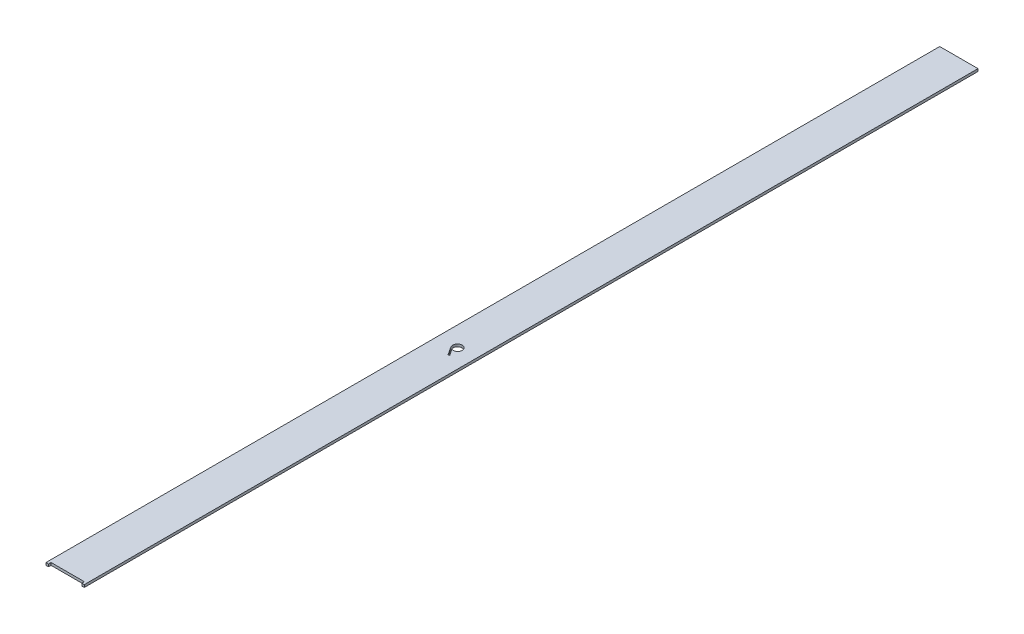
ISO-10303-21;
HEADER;
FILE_DESCRIPTION(('STEP AP214'),'2;1');
FILE_NAME('part.step','',(''),(''),'','','');
FILE_SCHEMA(('AUTOMOTIVE_DESIGN { 1 0 10303 214 1 1 1 1 }'));
ENDSEC;
DATA;
#1=APPLICATION_CONTEXT('core data for automotive mechanical design processes');
#2=APPLICATION_PROTOCOL_DEFINITION('international standard','automotive_design',2000,#1);
#3=PRODUCT_CONTEXT('',#1,'mechanical');
#4=PRODUCT('Part','Part','',(#3));
#5=PRODUCT_RELATED_PRODUCT_CATEGORY('part','',(#4));
#6=PRODUCT_DEFINITION_FORMATION('','',#4);
#7=PRODUCT_DEFINITION_CONTEXT('part definition',#1,'design');
#8=PRODUCT_DEFINITION('design','',#6,#7);
#9=PRODUCT_DEFINITION_SHAPE('','',#8);
#10=(LENGTH_UNIT() NAMED_UNIT(*) SI_UNIT(.MILLI.,.METRE.));
#11=(NAMED_UNIT(*) PLANE_ANGLE_UNIT() SI_UNIT($,.RADIAN.));
#12=(NAMED_UNIT(*) SI_UNIT($,.STERADIAN.) SOLID_ANGLE_UNIT());
#13=UNCERTAINTY_MEASURE_WITH_UNIT(LENGTH_MEASURE(1.E-05),#10,'distance_accuracy_value','');
#14=(GEOMETRIC_REPRESENTATION_CONTEXT(3) GLOBAL_UNCERTAINTY_ASSIGNED_CONTEXT((#13)) GLOBAL_UNIT_ASSIGNED_CONTEXT((#10,
#11,#12)) REPRESENTATION_CONTEXT('',''));
#15=CARTESIAN_POINT('',(0.,0.,0.));
#16=DIRECTION('',(0.,0.,1.));
#17=DIRECTION('',(1.,0.,0.));
#18=AXIS2_PLACEMENT_3D('',#15,#16,#17);
#19=CARTESIAN_POINT('',(28.333397421911,-200.,-54.7794623895226));
#20=DIRECTION('',(0.836933063027773,0.,-0.547305260353809));
#21=DIRECTION('',(-0.547305260353809,0.,-0.836933063027773));
#22=AXIS2_PLACEMENT_3D('',#19,#20,#21);
#23=PLANE('',#22);
#24=DIRECTION('',(0.,-1.,0.));
#25=VECTOR('',#24,1.);
#26=CARTESIAN_POINT('',(28.333397421911,-200.,-54.7794623895226));
#27=LINE('',#26,#25);
#28=CARTESIAN_POINT('',(28.333397421911,-196.825,-54.7794623895226));
#29=VERTEX_POINT('',#28);
#30=CARTESIAN_POINT('',(28.333397421911,-200.,-54.7794623895226));
#31=VERTEX_POINT('',#30);
#32=EDGE_CURVE('E11',#29,#31,#27,.T.);
#33=ORIENTED_EDGE('',*,*,#32,.F.);
#34=DIRECTION('',(-0.547305260353809,0.,-0.836933063027773));
#35=VECTOR('',#34,1.);
#36=CARTESIAN_POINT('',(28.333397421911,-196.825,-54.7794623895226));
#37=LINE('',#36,#35);
#38=CARTESIAN_POINT('',(23.2999539122956,-196.825,-62.476547726061));
#39=VERTEX_POINT('',#38);
#40=EDGE_CURVE('E145',#29,#39,#37,.T.);
#41=ORIENTED_EDGE('',*,*,#40,.T.);
#42=DIRECTION('',(0.,-1.,0.));
#43=VECTOR('',#42,1.);
#44=CARTESIAN_POINT('',(23.2999539122956,-200.,-62.4765477260611));
#45=LINE('',#44,#43);
#46=CARTESIAN_POINT('',(23.2999539122956,-200.,-62.4765477260611));
#47=VERTEX_POINT('',#46);
#48=EDGE_CURVE('E62',#39,#47,#45,.T.);
#49=ORIENTED_EDGE('',*,*,#48,.T.);
#50=DIRECTION('',(-0.547305260353809,0.,-0.836933063027773));
#51=VECTOR('',#50,1.);
#52=CARTESIAN_POINT('',(28.333397421911,-200.,-54.7794623895226));
#53=LINE('',#52,#51);
#54=EDGE_CURVE('E261',#31,#47,#53,.T.);
#55=ORIENTED_EDGE('',*,*,#54,.F.);
#56=EDGE_LOOP('',(#33,#41,#49,#55));
#57=FACE_BOUND('',#56,.T.);
#58=ADVANCED_FACE('F51',(#57),#23,.F.);
#59=CARTESIAN_POINT('',(23.2999539122956,-200.,-62.4765477260611));
#60=CARTESIAN_POINT('',(23.635072134162,-200.,-62.4231322845037));
#61=CARTESIAN_POINT('',(24.2887581164709,-200.,-62.3189394262626));
#62=CARTESIAN_POINT('',(24.9504239355822,-200.,-62.3017511803219));
#63=CARTESIAN_POINT('',(25.2728805949879,-200.,-62.293374649138));
#64=B_SPLINE_CURVE_WITH_KNOTS('',3,(#59,#60,#61,#62,#63),.UNSPECIFIED.,.F.,.F.,(4,1,4),(0.,
0.512659336341781,1.),.UNSPECIFIED.);
#65=DIRECTION('',(0.,1.,0.));
#66=VECTOR('',#65,1.);
#67=SURFACE_OF_LINEAR_EXTRUSION('',#64,#66);
#68=ORIENTED_EDGE('',*,*,#48,.F.);
#69=CARTESIAN_POINT('',(23.2999539122956,-196.825,-62.4765477260611));
#70=CARTESIAN_POINT('',(23.635072134162,-196.825,-62.4231322845037));
#71=CARTESIAN_POINT('',(24.2887581164709,-196.825,-62.3189394262626));
#72=CARTESIAN_POINT('',(24.9504239355822,-196.825,-62.3017511803219));
#73=CARTESIAN_POINT('',(25.2728805949879,-196.825,-62.293374649138));
#74=B_SPLINE_CURVE_WITH_KNOTS('',3,(#69,#70,#71,#72,#73),.UNSPECIFIED.,.F.,.F.,(4,1,4),(0.,
0.512659336341781,1.),.UNSPECIFIED.);
#75=CARTESIAN_POINT('',(25.2728805949879,-196.825,-62.293374649138));
#76=VERTEX_POINT('',#75);
#77=EDGE_CURVE('E193',#39,#76,#74,.T.);
#78=ORIENTED_EDGE('',*,*,#77,.T.);
#79=DIRECTION('',(0.,-1.,0.));
#80=VECTOR('',#79,1.);
#81=CARTESIAN_POINT('',(25.2728805949879,-200.,-62.293374649138));
#82=LINE('',#81,#80);
#83=CARTESIAN_POINT('',(25.2728805949879,-200.,-62.293374649138));
#84=VERTEX_POINT('',#83);
#85=EDGE_CURVE('E252',#76,#84,#82,.T.);
#86=ORIENTED_EDGE('',*,*,#85,.T.);
#87=EDGE_CURVE('E270',#47,#84,#64,.T.);
#88=ORIENTED_EDGE('',*,*,#87,.F.);
#89=EDGE_LOOP('',(#68,#78,#86,#88));
#90=FACE_BOUND('',#89,.T.);
#91=ADVANCED_FACE('F274',(#90),#67,.F.);
#92=CARTESIAN_POINT('',(25.2728805949879,-200.,-62.293374649138));
#93=CARTESIAN_POINT('',(25.466496610755,-200.,-62.2985786285107));
#94=CARTESIAN_POINT('',(25.8476239760938,-200.,-62.3088225070439));
#95=CARTESIAN_POINT('',(26.4071867136408,-200.,-62.3876560372381));
#96=CARTESIAN_POINT('',(26.9448807794377,-200.,-62.5118898607081));
#97=CARTESIAN_POINT('',(27.4584775547135,-200.,-62.6929859966547));
#98=CARTESIAN_POINT('',(27.9498204988349,-200.,-62.9243202396838));
#99=CARTESIAN_POINT('',(28.4217292547971,-200.,-63.201573233639));
#100=CARTESIAN_POINT('',(28.8653330526609,-200.,-63.5390612938665));
#101=CARTESIAN_POINT('',(29.2863444709428,-200.,-63.9160605532044));
#102=CARTESIAN_POINT('',(29.6685805296102,-200.,-64.3336201402422));
#103=CARTESIAN_POINT('',(30.0069959177161,-200.,-64.7766759871709));
#104=CARTESIAN_POINT('',(30.2912588841547,-200.,-65.2447664966039));
#105=CARTESIAN_POINT('',(30.5218940860855,-200.,-65.7376545811839));
#106=CARTESIAN_POINT('',(30.7009906395968,-200.,-66.2545804653634));
#107=CARTESIAN_POINT('',(30.8315519647627,-200.,-66.794882767436));
#108=CARTESIAN_POINT('',(30.908729462825,-200.,-67.3589340620975));
#109=CARTESIAN_POINT('',(30.9192096337171,-200.,-67.7425367017606));
#110=CARTESIAN_POINT('',(30.9245332392186,-200.,-67.9373950818303));
#111=B_SPLINE_CURVE_WITH_KNOTS('',3,(#92,#93,#94,#95,#96,#97,#98,#99,#100,#101,#102,#103,#104,
#105,#106,#107,#108,#109,#110),.UNSPECIFIED.,.F.,.F.,(4,1,1,1,1,1,1,1,1,1,1,1,1,1,1,1,4),(0.,
0.0652308037420294,0.128404896003223,0.190067071596478,0.25094336576828,0.311545832852143,
0.37286280215683,0.435023673856238,0.499071724707044,0.563091075049662,0.625510106330375,
0.686680035929649,0.747282503013513,0.808563495215959,0.870742103515987,0.934340951505912,1.),.UNSPECIFIED.);
#112=DIRECTION('',(0.,1.,0.));
#113=VECTOR('',#112,1.);
#114=SURFACE_OF_LINEAR_EXTRUSION('',#111,#113);
#115=ORIENTED_EDGE('',*,*,#85,.F.);
#116=CARTESIAN_POINT('',(25.2728805949879,-196.825,-62.293374649138));
#117=CARTESIAN_POINT('',(25.466496610755,-196.825,-62.2985786285107));
#118=CARTESIAN_POINT('',(25.8476239760938,-196.825,-62.3088225070439));
#119=CARTESIAN_POINT('',(26.4071867136408,-196.825,-62.3876560372381));
#120=CARTESIAN_POINT('',(26.9448807794377,-196.825,-62.5118898607081));
#121=CARTESIAN_POINT('',(27.4584775547135,-196.825,-62.6929859966547));
#122=CARTESIAN_POINT('',(27.9498204988349,-196.825,-62.9243202396838));
#123=CARTESIAN_POINT('',(28.4217292547971,-196.825,-63.201573233639));
#124=CARTESIAN_POINT('',(28.8653330526609,-196.825,-63.5390612938665));
#125=CARTESIAN_POINT('',(29.2863444709428,-196.825,-63.9160605532044));
#126=CARTESIAN_POINT('',(29.6685805296102,-196.825,-64.3336201402422));
#127=CARTESIAN_POINT('',(30.0069959177161,-196.825,-64.7766759871709));
#128=CARTESIAN_POINT('',(30.2912588841547,-196.825,-65.2447664966039));
#129=CARTESIAN_POINT('',(30.5218940860855,-196.825,-65.7376545811839));
#130=CARTESIAN_POINT('',(30.7009906395968,-196.825,-66.2545804653634));
#131=CARTESIAN_POINT('',(30.8315519647627,-196.825,-66.794882767436));
#132=CARTESIAN_POINT('',(30.908729462825,-196.825,-67.3589340620975));
#133=CARTESIAN_POINT('',(30.9192096337171,-196.825,-67.7425367017606));
#134=CARTESIAN_POINT('',(30.9245332392186,-196.825,-67.9373950818303));
#135=B_SPLINE_CURVE_WITH_KNOTS('',3,(#116,#117,#118,#119,#120,#121,#122,#123,#124,#125,#126,
#127,#128,#129,#130,#131,#132,#133,#134),.UNSPECIFIED.,.F.,.F.,(4,1,1,1,1,1,1,1,1,1,1,1,1,1,1,1,
4),(0.,0.0652308037420294,0.128404896003223,0.190067071596478,0.25094336576828,
0.311545832852143,0.37286280215683,0.435023673856238,0.499071724707044,0.563091075049662,
0.625510106330375,0.686680035929649,0.747282503013513,0.808563495215959,0.870742103515987,
0.934340951505912,1.),.UNSPECIFIED.);
#136=CARTESIAN_POINT('',(30.9245332392186,-196.825,-67.9373950818303));
#137=VERTEX_POINT('',#136);
#138=EDGE_CURVE('E184',#76,#137,#135,.T.);
#139=ORIENTED_EDGE('',*,*,#138,.T.);
#140=DIRECTION('',(0.,-1.,0.));
#141=VECTOR('',#140,1.);
#142=CARTESIAN_POINT('',(30.9245332392186,-200.,-67.9373950818303));
#143=LINE('',#142,#141);
#144=CARTESIAN_POINT('',(30.9245332392186,-200.,-67.9373950818303));
#145=VERTEX_POINT('',#144);
#146=EDGE_CURVE('E248',#137,#145,#143,.T.);
#147=ORIENTED_EDGE('',*,*,#146,.T.);
#148=EDGE_CURVE('E276',#84,#145,#111,.T.);
#149=ORIENTED_EDGE('',*,*,#148,.F.);
#150=EDGE_LOOP('',(#115,#139,#147,#149));
#151=FACE_BOUND('',#150,.T.);
#152=ADVANCED_FACE('F295',(#151),#114,.F.);
#153=CARTESIAN_POINT('',(30.9245332392186,-200.,-67.9373950818303));
#154=CARTESIAN_POINT('',(30.9167874826346,-200.,-68.2039846133123));
#155=CARTESIAN_POINT('',(30.9015456667687,-200.,-68.7285697208519));
#156=CARTESIAN_POINT('',(30.7496692912848,-200.,-69.4926200799963));
#157=CARTESIAN_POINT('',(30.5136689391165,-200.,-70.2205070573977));
#158=CARTESIAN_POINT('',(30.1763341059508,-200.,-70.9006093187028));
#159=CARTESIAN_POINT('',(29.7573299928536,-200.,-71.5319947331207));
#160=CARTESIAN_POINT('',(29.2463676670475,-200.,-72.0914413377731));
#161=CARTESIAN_POINT('',(28.6615681091149,-200.,-72.5903882551726));
#162=CARTESIAN_POINT('',(28.0003328218781,-200.,-73.0076192825757));
#163=CARTESIAN_POINT('',(27.2887175457591,-200.,-73.3483587459434));
#164=CARTESIAN_POINT('',(26.5411302455468,-200.,-73.5930981349944));
#165=CARTESIAN_POINT('',(25.7648310633292,-200.,-73.7437753041079));
#166=CARTESIAN_POINT('',(25.2379374109179,-200.,-73.7626652986255));
#167=CARTESIAN_POINT('',(24.9714082392186,-200.,-73.7722208029842));
#168=B_SPLINE_CURVE_WITH_KNOTS('',3,(#153,#154,#155,#156,#157,#158,#159,#160,#161,#162,#163,
#164,#165,#166,#167),.UNSPECIFIED.,.F.,.F.,(4,1,1,1,1,1,1,1,1,1,1,1,4),(0.,0.085947943144129,
0.169125211880691,0.250399107186049,0.332289736138836,0.413364287915881,0.494172283371189,
0.576021735386637,0.660756969254007,0.745783125913744,0.830043592975224,0.914027545820683,1.),.UNSPECIFIED.);
#169=DIRECTION('',(0.,1.,0.));
#170=VECTOR('',#169,1.);
#171=SURFACE_OF_LINEAR_EXTRUSION('',#168,#170);
#172=ORIENTED_EDGE('',*,*,#146,.F.);
#173=CARTESIAN_POINT('',(30.9245332392186,-196.825,-67.9373950818303));
#174=CARTESIAN_POINT('',(30.9167874826346,-196.825,-68.2039846133123));
#175=CARTESIAN_POINT('',(30.9015456667687,-196.825,-68.7285697208519));
#176=CARTESIAN_POINT('',(30.7496692912848,-196.825,-69.4926200799963));
#177=CARTESIAN_POINT('',(30.5136689391165,-196.825,-70.2205070573977));
#178=CARTESIAN_POINT('',(30.1763341059508,-196.825,-70.9006093187028));
#179=CARTESIAN_POINT('',(29.7573299928536,-196.825,-71.5319947331207));
#180=CARTESIAN_POINT('',(29.2463676670475,-196.825,-72.0914413377731));
#181=CARTESIAN_POINT('',(28.6615681091149,-196.825,-72.5903882551726));
#182=CARTESIAN_POINT('',(28.0003328218781,-196.825,-73.0076192825757));
#183=CARTESIAN_POINT('',(27.2887175457591,-196.825,-73.3483587459434));
#184=CARTESIAN_POINT('',(26.5411302455468,-196.825,-73.5930981349944));
#185=CARTESIAN_POINT('',(25.7648310633292,-196.825,-73.7437753041079));
#186=CARTESIAN_POINT('',(25.2379374109179,-196.825,-73.7626652986255));
#187=CARTESIAN_POINT('',(24.9714082392186,-196.825,-73.7722208029842));
#188=B_SPLINE_CURVE_WITH_KNOTS('',3,(#173,#174,#175,#176,#177,#178,#179,#180,#181,#182,#183,
#184,#185,#186,#187),.UNSPECIFIED.,.F.,.F.,(4,1,1,1,1,1,1,1,1,1,1,1,4),(0.,0.085947943144129,
0.169125211880691,0.250399107186049,0.332289736138836,0.413364287915881,0.494172283371189,
0.576021735386637,0.660756969254007,0.745783125913744,0.830043592975224,0.914027545820683,1.),.UNSPECIFIED.);
#189=CARTESIAN_POINT('',(24.9714082392186,-196.825,-73.7722208029842));
#190=VERTEX_POINT('',#189);
#191=EDGE_CURVE('E175',#137,#190,#188,.T.);
#192=ORIENTED_EDGE('',*,*,#191,.T.);
#193=DIRECTION('',(0.,-1.,0.));
#194=VECTOR('',#193,1.);
#195=CARTESIAN_POINT('',(24.9714082392186,-200.,-73.7722208029842));
#196=LINE('',#195,#194);
#197=CARTESIAN_POINT('',(24.9714082392186,-200.,-73.7722208029842));
#198=VERTEX_POINT('',#197);
#199=EDGE_CURVE('E244',#190,#198,#196,.T.);
#200=ORIENTED_EDGE('',*,*,#199,.T.);
#201=EDGE_CURVE('E279',#145,#198,#168,.T.);
#202=ORIENTED_EDGE('',*,*,#201,.F.);
#203=EDGE_LOOP('',(#172,#192,#200,#202));
#204=FACE_BOUND('',#203,.T.);
#205=ADVANCED_FACE('F316',(#204),#171,.F.);
#206=CARTESIAN_POINT('',(24.9714082392186,-200.,-73.7722208029842));
#207=CARTESIAN_POINT('',(24.7150676256666,-200.,-73.7639029974362));
#208=CARTESIAN_POINT('',(24.2073017519402,-200.,-73.7474268809791));
#209=CARTESIAN_POINT('',(23.4603632575903,-200.,-73.6006551334058));
#210=CARTESIAN_POINT('',(22.7426516917751,-200.,-73.3627636169073));
#211=CARTESIAN_POINT('',(22.0591954899762,-200.,-73.0350259008381));
#212=CARTESIAN_POINT('',(21.42607901104,-200.,-72.6210537093399));
#213=CARTESIAN_POINT('',(20.859664618457,-200.,-72.1226933043503));
#214=CARTESIAN_POINT('',(20.3627765312167,-200.,-71.550597501599));
#215=CARTESIAN_POINT('',(19.9492575230081,-200.,-70.904855040019));
#216=CARTESIAN_POINT('',(19.6212778534097,-200.,-70.2109454141736));
#217=CARTESIAN_POINT('',(19.3753155467053,-200.,-69.4873874629676));
#218=CARTESIAN_POINT('',(19.2316445656685,-200.,-68.7368175624314));
#219=CARTESIAN_POINT('',(19.2115682776947,-200.,-68.2280130762878));
#220=CARTESIAN_POINT('',(19.2014563161417,-200.,-67.9717400337534));
#221=B_SPLINE_CURVE_WITH_KNOTS('',3,(#206,#207,#208,#209,#210,#211,#212,#213,#214,#215,#216,
#217,#218,#219,#220),.UNSPECIFIED.,.F.,.F.,(4,1,1,1,1,1,1,1,1,1,1,1,4),(0.,0.084334721992627,
0.167052318416074,0.249566077240966,0.332740481801847,0.415914886362728,0.497828009539996,
0.580372588608052,0.664600121056504,0.749466693112618,0.832510233940141,0.915639281668174,1.),.UNSPECIFIED.);
#222=DIRECTION('',(0.,1.,0.));
#223=VECTOR('',#222,1.);
#224=SURFACE_OF_LINEAR_EXTRUSION('',#221,#223);
#225=ORIENTED_EDGE('',*,*,#199,.F.);
#226=CARTESIAN_POINT('',(24.9714082392186,-196.825,-73.7722208029842));
#227=CARTESIAN_POINT('',(24.7150676256666,-196.825,-73.7639029974362));
#228=CARTESIAN_POINT('',(24.2073017519402,-196.825,-73.7474268809791));
#229=CARTESIAN_POINT('',(23.4603632575903,-196.825,-73.6006551334058));
#230=CARTESIAN_POINT('',(22.7426516917751,-196.825,-73.3627636169073));
#231=CARTESIAN_POINT('',(22.0591954899762,-196.825,-73.0350259008381));
#232=CARTESIAN_POINT('',(21.42607901104,-196.825,-72.6210537093399));
#233=CARTESIAN_POINT('',(20.859664618457,-196.825,-72.1226933043503));
#234=CARTESIAN_POINT('',(20.3627765312167,-196.825,-71.550597501599));
#235=CARTESIAN_POINT('',(19.9492575230081,-196.825,-70.904855040019));
#236=CARTESIAN_POINT('',(19.6212778534097,-196.825,-70.2109454141736));
#237=CARTESIAN_POINT('',(19.3753155467053,-196.825,-69.4873874629676));
#238=CARTESIAN_POINT('',(19.2316445656685,-196.825,-68.7368175624314));
#239=CARTESIAN_POINT('',(19.2115682776947,-196.825,-68.2280130762878));
#240=CARTESIAN_POINT('',(19.2014563161417,-196.825,-67.9717400337534));
#241=B_SPLINE_CURVE_WITH_KNOTS('',3,(#226,#227,#228,#229,#230,#231,#232,#233,#234,#235,#236,
#237,#238,#239,#240),.UNSPECIFIED.,.F.,.F.,(4,1,1,1,1,1,1,1,1,1,1,1,4),(0.,0.084334721992627,
0.167052318416074,0.249566077240966,0.332740481801847,0.415914886362728,0.497828009539996,
0.580372588608052,0.664600121056504,0.749466693112618,0.832510233940141,0.915639281668174,1.),.UNSPECIFIED.);
#242=CARTESIAN_POINT('',(19.2014563161417,-196.825,-67.9717400337534));
#243=VERTEX_POINT('',#242);
#244=EDGE_CURVE('E166',#190,#243,#241,.T.);
#245=ORIENTED_EDGE('',*,*,#244,.T.);
#246=DIRECTION('',(0.,-1.,0.));
#247=VECTOR('',#246,1.);
#248=CARTESIAN_POINT('',(19.2014563161417,-200.,-67.9717400337534));
#249=LINE('',#248,#247);
#250=CARTESIAN_POINT('',(19.2014563161417,-200.,-67.9717400337534));
#251=VERTEX_POINT('',#250);
#252=EDGE_CURVE('E241',#243,#251,#249,.T.);
#253=ORIENTED_EDGE('',*,*,#252,.T.);
#254=EDGE_CURVE('E450',#198,#251,#221,.T.);
#255=ORIENTED_EDGE('',*,*,#254,.F.);
#256=EDGE_LOOP('',(#225,#245,#253,#255));
#257=FACE_BOUND('',#256,.T.);
#258=ADVANCED_FACE('F324',(#257),#224,.F.);
#259=CARTESIAN_POINT('',(19.2014563161417,-200.,-67.9717400337534));
#260=CARTESIAN_POINT('',(19.2078867525346,-200.,-67.7755545165683));
#261=CARTESIAN_POINT('',(19.221016475007,-200.,-67.374981174981));
#262=CARTESIAN_POINT('',(19.31269264242,-200.,-66.768298394317));
#263=CARTESIAN_POINT('',(19.4600024540262,-200.,-66.1475346494907));
#264=CARTESIAN_POINT('',(19.6249767948874,-200.,-65.6209153957742));
#265=CARTESIAN_POINT('',(19.7992876152757,-200.,-65.1895062548227));
#266=CARTESIAN_POINT('',(19.9443535807453,-200.,-64.8416886844251));
#267=CARTESIAN_POINT('',(20.1249149020515,-200.,-64.4837605572475));
#268=CARTESIAN_POINT('',(20.3174471625559,-200.,-64.1034483385545));
#269=CARTESIAN_POINT('',(20.5392809776472,-200.,-63.7105533406355));
#270=CARTESIAN_POINT('',(20.7804847264609,-200.,-63.2985090825672));
#271=CARTESIAN_POINT('',(21.0477271121039,-200.,-62.8738686477215));
#272=CARTESIAN_POINT('',(21.2350711407645,-200.,-62.5857009564492));
#273=CARTESIAN_POINT('',(21.3308433353725,-200.,-62.4383866683688));
#274=B_SPLINE_CURVE_WITH_KNOTS('',3,(#259,#260,#261,#262,#263,#264,#265,#266,#267,#268,#269,
#270,#271,#272,#273),.UNSPECIFIED.,.F.,.F.,(4,1,1,1,1,1,1,1,1,1,1,1,4),(0.,0.0978181896147143,
0.199726053401827,0.30527635747794,0.415811490538293,0.474472231143561,0.537273879776098,
0.603657420559658,0.674298863090126,0.74983448531623,0.828598476757101,0.912377778157781,1.),.UNSPECIFIED.);
#275=DIRECTION('',(0.,1.,0.));
#276=VECTOR('',#275,1.);
#277=SURFACE_OF_LINEAR_EXTRUSION('',#274,#276);
#278=ORIENTED_EDGE('',*,*,#252,.F.);
#279=CARTESIAN_POINT('',(19.2014563161417,-196.825,-67.9717400337534));
#280=CARTESIAN_POINT('',(19.2078867525346,-196.825,-67.7755545165683));
#281=CARTESIAN_POINT('',(19.221016475007,-196.825,-67.374981174981));
#282=CARTESIAN_POINT('',(19.31269264242,-196.825,-66.768298394317));
#283=CARTESIAN_POINT('',(19.4600024540262,-196.825,-66.1475346494907));
#284=CARTESIAN_POINT('',(19.6249767948874,-196.825,-65.6209153957742));
#285=CARTESIAN_POINT('',(19.7992876152757,-196.825,-65.1895062548227));
#286=CARTESIAN_POINT('',(19.9443535807453,-196.825,-64.8416886844251));
#287=CARTESIAN_POINT('',(20.1249149020515,-196.825,-64.4837605572475));
#288=CARTESIAN_POINT('',(20.3174471625559,-196.825,-64.1034483385545));
#289=CARTESIAN_POINT('',(20.5392809776472,-196.825,-63.7105533406355));
#290=CARTESIAN_POINT('',(20.7804847264609,-196.825,-63.2985090825672));
#291=CARTESIAN_POINT('',(21.0477271121039,-196.825,-62.8738686477215));
#292=CARTESIAN_POINT('',(21.2350711407645,-196.825,-62.5857009564492));
#293=CARTESIAN_POINT('',(21.3308433353725,-196.825,-62.4383866683688));
#294=B_SPLINE_CURVE_WITH_KNOTS('',3,(#279,#280,#281,#282,#283,#284,#285,#286,#287,#288,#289,
#290,#291,#292,#293),.UNSPECIFIED.,.F.,.F.,(4,1,1,1,1,1,1,1,1,1,1,1,4),(0.,0.0978181896147143,
0.199726053401827,0.30527635747794,0.415811490538293,0.474472231143561,0.537273879776098,
0.603657420559658,0.674298863090126,0.74983448531623,0.828598476757101,0.912377778157781,1.),.UNSPECIFIED.);
#295=CARTESIAN_POINT('',(21.3308433353725,-196.825,-62.4383866683688));
#296=VERTEX_POINT('',#295);
#297=EDGE_CURVE('E160',#243,#296,#294,.T.);
#298=ORIENTED_EDGE('',*,*,#297,.T.);
#299=DIRECTION('',(0.,-1.,0.));
#300=VECTOR('',#299,1.);
#301=CARTESIAN_POINT('',(21.3308433353725,-200.,-62.4383866683688));
#302=LINE('',#301,#300);
#303=CARTESIAN_POINT('',(21.3308433353725,-200.,-62.4383866683688));
#304=VERTEX_POINT('',#303);
#305=EDGE_CURVE('E70',#296,#304,#302,.T.);
#306=ORIENTED_EDGE('',*,*,#305,.T.);
#307=EDGE_CURVE('E238',#251,#304,#274,.T.);
#308=ORIENTED_EDGE('',*,*,#307,.F.);
#309=EDGE_LOOP('',(#278,#298,#306,#308));
#310=FACE_BOUND('',#309,.T.);
#311=ADVANCED_FACE('F332',(#310),#277,.F.);
#312=CARTESIAN_POINT('',(21.3308433353725,-200.,-62.4383866683688));
#313=DIRECTION('',(-0.836878996160949,0.,0.547387929885783));
#314=DIRECTION('',(0.547387929885783,0.,0.836878996160948));
#315=AXIS2_PLACEMENT_3D('',#312,#313,#314);
#316=PLANE('',#315);
#317=ORIENTED_EDGE('',*,*,#305,.F.);
#318=DIRECTION('',(0.547387929885783,0.,0.836878996160948));
#319=VECTOR('',#318,1.);
#320=CARTESIAN_POINT('',(21.3308433353725,-196.825,-62.4383866683688));
#321=LINE('',#320,#319);
#322=CARTESIAN_POINT('',(27.0168409315263,-196.825,-53.7452977260611));
#323=VERTEX_POINT('',#322);
#324=EDGE_CURVE('E143',#296,#323,#321,.T.);
#325=ORIENTED_EDGE('',*,*,#324,.T.);
#326=DIRECTION('',(0.,-1.,0.));
#327=VECTOR('',#326,1.);
#328=CARTESIAN_POINT('',(27.0168409315263,-200.,-53.7452977260611));
#329=LINE('',#328,#327);
#330=CARTESIAN_POINT('',(27.0168409315263,-200.,-53.7452977260611));
#331=VERTEX_POINT('',#330);
#332=EDGE_CURVE('E55',#323,#331,#329,.T.);
#333=ORIENTED_EDGE('',*,*,#332,.T.);
#334=DIRECTION('',(0.547387929885783,0.,0.836878996160948));
#335=VECTOR('',#334,1.);
#336=CARTESIAN_POINT('',(21.3308433353725,-200.,-62.4383866683688));
#337=LINE('',#336,#335);
#338=EDGE_CURVE('E511',#304,#331,#337,.T.);
#339=ORIENTED_EDGE('',*,*,#338,.F.);
#340=EDGE_LOOP('',(#317,#325,#333,#339));
#341=FACE_BOUND('',#340,.T.);
#342=ADVANCED_FACE('F148',(#341),#316,.F.);
#343=CARTESIAN_POINT('',(100.,-200.,426.675));
#344=DIRECTION('',(0.,0.,-1.));
#345=DIRECTION('',(-1.,0.,0.));
#346=AXIS2_PLACEMENT_3D('',#343,#344,#345);
#347=PLANE('',#346);
#348=DIRECTION('',(0.,-1.,0.));
#349=VECTOR('',#348,1.);
#350=CARTESIAN_POINT('',(3.175,-200.,426.675));
#351=LINE('',#350,#349);
#352=CARTESIAN_POINT('',(3.175,-196.825,426.675));
#353=VERTEX_POINT('',#352);
#354=CARTESIAN_POINT('',(3.175,-200.,426.675));
#355=VERTEX_POINT('',#354);
#356=EDGE_CURVE('E138',#353,#355,#351,.T.);
#357=ORIENTED_EDGE('',*,*,#356,.F.);
#358=DIRECTION('',(1.,0.,0.));
#359=VECTOR('',#358,1.);
#360=CARTESIAN_POINT('',(48.35,-196.825,426.675));
#361=LINE('',#360,#359);
#362=CARTESIAN_POINT('',(0.,-196.825,426.675));
#363=VERTEX_POINT('',#362);
#364=EDGE_CURVE('E475',#353,#363,#361,.F.);
#365=ORIENTED_EDGE('',*,*,#364,.T.);
#366=DIRECTION('',(0.,-1.,0.));
#367=VECTOR('',#366,1.);
#368=CARTESIAN_POINT('',(0.,-200.,426.675));
#369=LINE('',#368,#367);
#370=CARTESIAN_POINT('',(0.,-200.,426.675));
#371=VERTEX_POINT('',#370);
#372=EDGE_CURVE('E228',#363,#371,#369,.T.);
#373=ORIENTED_EDGE('',*,*,#372,.T.);
#374=DIRECTION('',(-1.,0.,0.));
#375=VECTOR('',#374,1.);
#376=CARTESIAN_POINT('',(100.,-200.,426.675));
#377=LINE('',#376,#375);
#378=EDGE_CURVE('E531',#355,#371,#377,.T.);
#379=ORIENTED_EDGE('',*,*,#378,.F.);
#380=EDGE_LOOP('',(#357,#365,#373,#379));
#381=FACE_BOUND('',#380,.T.);
#382=ADVANCED_FACE('F348',(#381),#347,.F.);
#383=CARTESIAN_POINT('',(0.,-200.,701.675));
#384=DIRECTION('',(1.,0.,0.));
#385=DIRECTION('',(0.,0.,-1.));
#386=AXIS2_PLACEMENT_3D('',#383,#384,#385);
#387=PLANE('',#386);
#388=ORIENTED_EDGE('',*,*,#372,.F.);
#389=DIRECTION('',(0.,0.,1.));
#390=VECTOR('',#389,1.);
#391=CARTESIAN_POINT('',(0.,-196.825,701.675));
#392=LINE('',#391,#390);
#393=CARTESIAN_POINT('',(0.,-196.825,-701.675));
#394=VERTEX_POINT('',#393);
#395=EDGE_CURVE('E472',#363,#394,#392,.F.);
#396=ORIENTED_EDGE('',*,*,#395,.T.);
#397=DIRECTION('',(0.,-1.,0.));
#398=VECTOR('',#397,1.);
#399=CARTESIAN_POINT('',(0.,-200.,-701.675));
#400=LINE('',#399,#398);
#401=CARTESIAN_POINT('',(0.,-200.,-701.675));
#402=VERTEX_POINT('',#401);
#403=EDGE_CURVE('E224',#394,#402,#400,.T.);
#404=ORIENTED_EDGE('',*,*,#403,.T.);
#405=DIRECTION('',(0.,0.,-1.));
#406=VECTOR('',#405,1.);
#407=CARTESIAN_POINT('',(0.,-200.,701.675));
#408=LINE('',#407,#406);
#409=EDGE_CURVE('E527',#371,#402,#408,.T.);
#410=ORIENTED_EDGE('',*,*,#409,.F.);
#411=EDGE_LOOP('',(#388,#396,#404,#410));
#412=FACE_BOUND('',#411,.T.);
#413=ADVANCED_FACE('F356',(#412),#387,.F.);
#414=CARTESIAN_POINT('',(48.35,-200.,-701.675));
#415=DIRECTION('',(0.,0.,1.));
#416=DIRECTION('',(1.,0.,0.));
#417=AXIS2_PLACEMENT_3D('',#414,#415,#416);
#418=PLANE('',#417);
#419=ORIENTED_EDGE('',*,*,#403,.F.);
#420=DIRECTION('',(1.,0.,0.));
#421=VECTOR('',#420,1.);
#422=CARTESIAN_POINT('',(48.35,-196.825,-701.675));
#423=LINE('',#422,#421);
#424=CARTESIAN_POINT('',(48.35,-196.825,-701.675));
#425=VERTEX_POINT('',#424);
#426=EDGE_CURVE('E468',#394,#425,#423,.T.);
#427=ORIENTED_EDGE('',*,*,#426,.T.);
#428=DIRECTION('',(0.,-1.,0.));
#429=VECTOR('',#428,1.);
#430=CARTESIAN_POINT('',(48.35,-200.,-701.675));
#431=LINE('',#430,#429);
#432=CARTESIAN_POINT('',(48.35,-200.,-701.675));
#433=VERTEX_POINT('',#432);
#434=EDGE_CURVE('E220',#425,#433,#431,.T.);
#435=ORIENTED_EDGE('',*,*,#434,.T.);
#436=DIRECTION('',(1.,0.,0.));
#437=VECTOR('',#436,1.);
#438=CARTESIAN_POINT('',(48.35,-200.,-701.675));
#439=LINE('',#438,#437);
#440=EDGE_CURVE('E523',#402,#433,#439,.T.);
#441=ORIENTED_EDGE('',*,*,#440,.F.);
#442=EDGE_LOOP('',(#419,#427,#435,#441));
#443=FACE_BOUND('',#442,.T.);
#444=ADVANCED_FACE('F366',(#443),#418,.F.);
#445=CARTESIAN_POINT('',(48.35,-200.,701.675));
#446=DIRECTION('',(1.,0.,0.));
#447=DIRECTION('',(0.,0.,-1.));
#448=AXIS2_PLACEMENT_3D('',#445,#446,#447);
#449=PLANE('',#448);
#450=ORIENTED_EDGE('',*,*,#434,.F.);
#451=DIRECTION('',(0.,0.,1.));
#452=VECTOR('',#451,1.);
#453=CARTESIAN_POINT('',(48.35,-196.825,701.675));
#454=LINE('',#453,#452);
#455=CARTESIAN_POINT('',(48.35,-196.825,426.675));
#456=VERTEX_POINT('',#455);
#457=EDGE_CURVE('E464',#456,#425,#454,.F.);
#458=ORIENTED_EDGE('',*,*,#457,.F.);
#459=DIRECTION('',(0.,-1.,0.));
#460=VECTOR('',#459,1.);
#461=CARTESIAN_POINT('',(48.35,-200.,426.675));
#462=LINE('',#461,#460);
#463=CARTESIAN_POINT('',(48.35,-200.,426.675));
#464=VERTEX_POINT('',#463);
#465=EDGE_CURVE('E216',#456,#464,#462,.T.);
#466=ORIENTED_EDGE('',*,*,#465,.T.);
#467=DIRECTION('',(0.,0.,-1.));
#468=VECTOR('',#467,1.);
#469=CARTESIAN_POINT('',(48.35,-200.,701.675));
#470=LINE('',#469,#468);
#471=EDGE_CURVE('E519',#464,#433,#470,.T.);
#472=ORIENTED_EDGE('',*,*,#471,.T.);
#473=EDGE_LOOP('',(#450,#458,#466,#472));
#474=FACE_BOUND('',#473,.T.);
#475=ADVANCED_FACE('F375',(#474),#449,.T.);
#476=ORIENTED_EDGE('',*,*,#465,.F.);
#477=DIRECTION('',(1.,0.,0.));
#478=VECTOR('',#477,1.);
#479=CARTESIAN_POINT('',(48.35,-196.825,426.675));
#480=LINE('',#479,#478);
#481=CARTESIAN_POINT('',(45.175,-196.825,426.675));
#482=VERTEX_POINT('',#481);
#483=EDGE_CURVE('E154',#456,#482,#480,.F.);
#484=ORIENTED_EDGE('',*,*,#483,.T.);
#485=DIRECTION('',(0.,-1.,0.));
#486=VECTOR('',#485,1.);
#487=CARTESIAN_POINT('',(45.175,-200.,426.675));
#488=LINE('',#487,#486);
#489=CARTESIAN_POINT('',(45.175,-200.,426.675));
#490=VERTEX_POINT('',#489);
#491=EDGE_CURVE('E211',#482,#490,#488,.T.);
#492=ORIENTED_EDGE('',*,*,#491,.T.);
#493=EDGE_CURVE('E516',#464,#490,#377,.T.);
#494=ORIENTED_EDGE('',*,*,#493,.F.);
#495=EDGE_LOOP('',(#476,#484,#492,#494));
#496=FACE_BOUND('',#495,.T.);
#497=ADVANCED_FACE('F359',(#496),#347,.F.);
#498=CARTESIAN_POINT('',(45.175,-200.,701.675));
#499=DIRECTION('',(1.,0.,0.));
#500=DIRECTION('',(0.,0.,-1.));
#501=AXIS2_PLACEMENT_3D('',#498,#499,#500);
#502=PLANE('',#501);
#503=ORIENTED_EDGE('',*,*,#491,.F.);
#504=DIRECTION('',(0.,0.,1.));
#505=VECTOR('',#504,1.);
#506=CARTESIAN_POINT('',(45.175,-196.825,701.675));
#507=LINE('',#506,#505);
#508=CARTESIAN_POINT('',(45.175,-196.825,423.468349071416));
#509=VERTEX_POINT('',#508);
#510=EDGE_CURVE('E150',#482,#509,#507,.F.);
#511=ORIENTED_EDGE('',*,*,#510,.T.);
#512=DIRECTION('',(0.,-1.,0.));
#513=VECTOR('',#512,1.);
#514=CARTESIAN_POINT('',(45.175,-200.,423.468349071416));
#515=LINE('',#514,#513);
#516=CARTESIAN_POINT('',(45.175,-200.,423.468349071416));
#517=VERTEX_POINT('',#516);
#518=EDGE_CURVE('E207',#509,#517,#515,.T.);
#519=ORIENTED_EDGE('',*,*,#518,.T.);
#520=DIRECTION('',(0.,0.,-1.));
#521=VECTOR('',#520,1.);
#522=CARTESIAN_POINT('',(45.175,-200.,701.675));
#523=LINE('',#522,#521);
#524=EDGE_CURVE('E493',#490,#517,#523,.T.);
#525=ORIENTED_EDGE('',*,*,#524,.F.);
#526=EDGE_LOOP('',(#503,#511,#519,#525));
#527=FACE_BOUND('',#526,.T.);
#528=ADVANCED_FACE('F392',(#527),#502,.F.);
#529=CARTESIAN_POINT('',(100.,-200.,423.468349071416));
#530=DIRECTION('',(0.,0.,-1.));
#531=DIRECTION('',(-1.,0.,0.));
#532=AXIS2_PLACEMENT_3D('',#529,#530,#531);
#533=PLANE('',#532);
#534=ORIENTED_EDGE('',*,*,#518,.F.);
#535=DIRECTION('',(1.,0.,0.));
#536=VECTOR('',#535,1.);
#537=CARTESIAN_POINT('',(48.35,-196.825,423.468349071416));
#538=LINE('',#537,#536);
#539=CARTESIAN_POINT('',(3.17500000000003,-196.825,423.468349071416));
#540=VERTEX_POINT('',#539);
#541=EDGE_CURVE('E454',#509,#540,#538,.F.);
#542=ORIENTED_EDGE('',*,*,#541,.T.);
#543=DIRECTION('',(0.,-1.,0.));
#544=VECTOR('',#543,1.);
#545=CARTESIAN_POINT('',(3.17500000000003,-200.,423.468349071416));
#546=LINE('',#545,#544);
#547=CARTESIAN_POINT('',(3.17500000000003,-200.,423.468349071416));
#548=VERTEX_POINT('',#547);
#549=EDGE_CURVE('E212',#540,#548,#546,.T.);
#550=ORIENTED_EDGE('',*,*,#549,.T.);
#551=DIRECTION('',(-1.,0.,0.));
#552=VECTOR('',#551,1.);
#553=CARTESIAN_POINT('',(100.,-200.,423.468349071416));
#554=LINE('',#553,#552);
#555=EDGE_CURVE('E165',#517,#548,#554,.T.);
#556=ORIENTED_EDGE('',*,*,#555,.F.);
#557=EDGE_LOOP('',(#534,#542,#550,#556));
#558=FACE_BOUND('',#557,.T.);
#559=ADVANCED_FACE('F400',(#558),#533,.F.);
#560=CARTESIAN_POINT('',(3.175,-200.,701.675));
#561=DIRECTION('',(-1.,0.,0.));
#562=DIRECTION('',(0.,0.,1.));
#563=AXIS2_PLACEMENT_3D('',#560,#561,#562);
#564=PLANE('',#563);
#565=DIRECTION('',(0.,0.,1.));
#566=VECTOR('',#565,1.);
#567=CARTESIAN_POINT('',(3.17500000000003,-196.825,701.675));
#568=LINE('',#567,#566);
#569=EDGE_CURVE('E158',#540,#353,#568,.T.);
#570=ORIENTED_EDGE('',*,*,#569,.T.);
#571=ORIENTED_EDGE('',*,*,#356,.T.);
#572=DIRECTION('',(0.,0.,1.));
#573=VECTOR('',#572,1.);
#574=CARTESIAN_POINT('',(3.175,-200.,701.675));
#575=LINE('',#574,#573);
#576=EDGE_CURVE('E535',#548,#355,#575,.T.);
#577=ORIENTED_EDGE('',*,*,#576,.F.);
#578=ORIENTED_EDGE('',*,*,#549,.F.);
#579=EDGE_LOOP('',(#570,#571,#577,#578));
#580=FACE_BOUND('',#579,.T.);
#581=ADVANCED_FACE('F409',(#580),#564,.F.);
#582=CARTESIAN_POINT('',(27.0168409315263,-200.,-53.7452977260611));
#583=DIRECTION('',(0.617720878793949,0.,0.786397428722928));
#584=DIRECTION('',(0.786397428722928,0.,-0.617720878793949));
#585=AXIS2_PLACEMENT_3D('',#582,#583,#584);
#586=PLANE('',#585);
#587=DIRECTION('',(0.786397428722928,0.,-0.617720878793949));
#588=VECTOR('',#587,1.);
#589=CARTESIAN_POINT('',(27.0168409315263,-196.825,-53.7452977260611));
#590=LINE('',#589,#588);
#591=EDGE_CURVE('E130',#323,#29,#590,.T.);
#592=ORIENTED_EDGE('',*,*,#591,.T.);
#593=ORIENTED_EDGE('',*,*,#32,.T.);
#594=DIRECTION('',(0.786397428722928,0.,-0.617720878793949));
#595=VECTOR('',#594,1.);
#596=CARTESIAN_POINT('',(27.0168409315263,-200.,-53.7452977260611));
#597=LINE('',#596,#595);
#598=EDGE_CURVE('E133',#331,#31,#597,.T.);
#599=ORIENTED_EDGE('',*,*,#598,.F.);
#600=ORIENTED_EDGE('',*,*,#332,.F.);
#601=EDGE_LOOP('',(#592,#593,#599,#600));
#602=FACE_BOUND('',#601,.T.);
#603=ADVANCED_FACE('F53',(#602),#586,.F.);
#604=CARTESIAN_POINT('',(48.35,-200.,701.675));
#605=DIRECTION('',(0.,1.,0.));
#606=DIRECTION('',(0.,0.,1.));
#607=AXIS2_PLACEMENT_3D('',#604,#605,#606);
#608=PLANE('',#607);
#609=ORIENTED_EDGE('',*,*,#555,.T.);
#610=ORIENTED_EDGE('',*,*,#576,.T.);
#611=ORIENTED_EDGE('',*,*,#378,.T.);
#612=ORIENTED_EDGE('',*,*,#409,.T.);
#613=ORIENTED_EDGE('',*,*,#440,.T.);
#614=ORIENTED_EDGE('',*,*,#471,.F.);
#615=ORIENTED_EDGE('',*,*,#493,.T.);
#616=ORIENTED_EDGE('',*,*,#524,.T.);
#617=EDGE_LOOP('',(#609,#610,#611,#612,#613,#614,#615,#616));
#618=FACE_BOUND('',#617,.T.);
#619=ORIENTED_EDGE('',*,*,#338,.T.);
#620=ORIENTED_EDGE('',*,*,#598,.T.);
#621=ORIENTED_EDGE('',*,*,#54,.T.);
#622=ORIENTED_EDGE('',*,*,#87,.T.);
#623=ORIENTED_EDGE('',*,*,#148,.T.);
#624=ORIENTED_EDGE('',*,*,#201,.T.);
#625=ORIENTED_EDGE('',*,*,#254,.T.);
#626=ORIENTED_EDGE('',*,*,#307,.T.);
#627=EDGE_LOOP('',(#619,#620,#621,#622,#623,#624,#625,#626));
#628=FACE_BOUND('',#627,.T.);
#629=ADVANCED_FACE('F268',(#618,#628),#608,.F.);
#630=CARTESIAN_POINT('',(48.35,-196.825,701.675));
#631=DIRECTION('',(0.,1.,0.));
#632=DIRECTION('',(0.,0.,1.));
#633=AXIS2_PLACEMENT_3D('',#630,#631,#632);
#634=PLANE('',#633);
#635=ORIENTED_EDGE('',*,*,#541,.F.);
#636=ORIENTED_EDGE('',*,*,#510,.F.);
#637=ORIENTED_EDGE('',*,*,#483,.F.);
#638=ORIENTED_EDGE('',*,*,#457,.T.);
#639=ORIENTED_EDGE('',*,*,#426,.F.);
#640=ORIENTED_EDGE('',*,*,#395,.F.);
#641=ORIENTED_EDGE('',*,*,#364,.F.);
#642=ORIENTED_EDGE('',*,*,#569,.F.);
#643=EDGE_LOOP('',(#635,#636,#637,#638,#639,#640,#641,#642));
#644=FACE_BOUND('',#643,.T.);
#645=ORIENTED_EDGE('',*,*,#324,.F.);
#646=ORIENTED_EDGE('',*,*,#297,.F.);
#647=ORIENTED_EDGE('',*,*,#244,.F.);
#648=ORIENTED_EDGE('',*,*,#191,.F.);
#649=ORIENTED_EDGE('',*,*,#138,.F.);
#650=ORIENTED_EDGE('',*,*,#77,.F.);
#651=ORIENTED_EDGE('',*,*,#40,.F.);
#652=ORIENTED_EDGE('',*,*,#591,.F.);
#653=EDGE_LOOP('',(#645,#646,#647,#648,#649,#650,#651,#652));
#654=FACE_BOUND('',#653,.T.);
#655=ADVANCED_FACE('F141',(#644,#654),#634,.T.);
#656=CLOSED_SHELL('',(#58,#91,#152,#205,#258,#311,#342,#382,#413,#444,#475,#497,#528,#559,#581,
#603,#629,#655));
#657=MANIFOLD_SOLID_BREP('B2',#656);
#658=ADVANCED_BREP_SHAPE_REPRESENTATION('',(#18,#657),#14);
#659=SHAPE_DEFINITION_REPRESENTATION(#9,#658);
ENDSEC;
END-ISO-10303-21;
